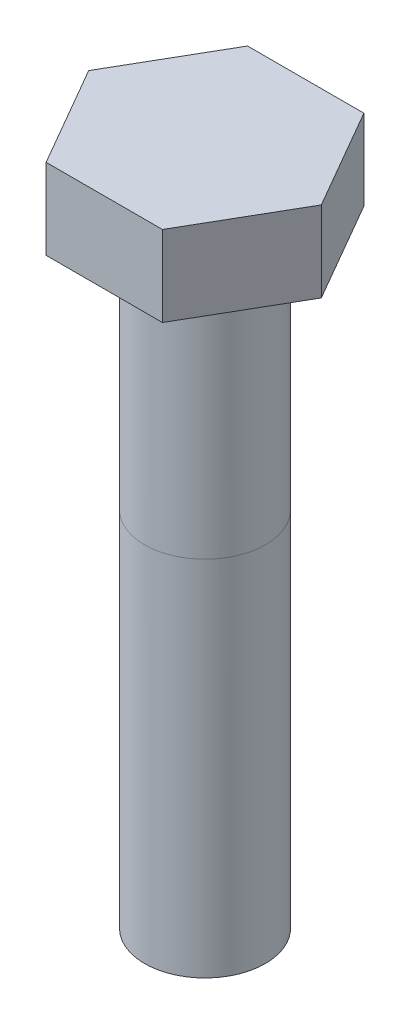
ISO-10303-21;
HEADER;
FILE_DESCRIPTION(('STEP AP214'),'2;1');
FILE_NAME('part.step','',(''),(''),'','','');
FILE_SCHEMA(('AUTOMOTIVE_DESIGN { 1 0 10303 214 1 1 1 1 }'));
ENDSEC;
DATA;
#1=APPLICATION_CONTEXT('core data for automotive mechanical design processes');
#2=APPLICATION_PROTOCOL_DEFINITION('international standard','automotive_design',2000,#1);
#3=PRODUCT_CONTEXT('',#1,'mechanical');
#4=PRODUCT('Part','Part','',(#3));
#5=PRODUCT_RELATED_PRODUCT_CATEGORY('part','',(#4));
#6=PRODUCT_DEFINITION_FORMATION('','',#4);
#7=PRODUCT_DEFINITION_CONTEXT('part definition',#1,'design');
#8=PRODUCT_DEFINITION('design','',#6,#7);
#9=PRODUCT_DEFINITION_SHAPE('','',#8);
#10=(LENGTH_UNIT() NAMED_UNIT(*) SI_UNIT(.MILLI.,.METRE.));
#11=(NAMED_UNIT(*) PLANE_ANGLE_UNIT() SI_UNIT($,.RADIAN.));
#12=(NAMED_UNIT(*) SI_UNIT($,.STERADIAN.) SOLID_ANGLE_UNIT());
#13=UNCERTAINTY_MEASURE_WITH_UNIT(LENGTH_MEASURE(1.E-05),#10,'distance_accuracy_value','');
#14=(GEOMETRIC_REPRESENTATION_CONTEXT(3) GLOBAL_UNCERTAINTY_ASSIGNED_CONTEXT((#13)) GLOBAL_UNIT_ASSIGNED_CONTEXT((#10,
#11,#12)) REPRESENTATION_CONTEXT('',''));
#15=CARTESIAN_POINT('',(0.,0.,0.));
#16=DIRECTION('',(0.,0.,1.));
#17=DIRECTION('',(1.,0.,0.));
#18=AXIS2_PLACEMENT_3D('',#15,#16,#17);
#19=CARTESIAN_POINT('',(0.,-30.,0.));
#20=DIRECTION('',(0.,1.,0.));
#21=DIRECTION('',(0.,0.,1.));
#22=AXIS2_PLACEMENT_3D('',#19,#20,#21);
#23=CYLINDRICAL_SURFACE('',#22,3.);
#24=CARTESIAN_POINT('',(0.,0.,0.));
#25=DIRECTION('',(0.,-1.,0.));
#26=DIRECTION('',(0.,0.,-1.));
#27=AXIS2_PLACEMENT_3D('',#24,#25,#26);
#28=CIRCLE('',#27,3.);
#29=CARTESIAN_POINT('',(0.,0.,-3.));
#30=VERTEX_POINT('',#29);
#31=EDGE_CURVE('E115',#30,#30,#28,.T.);
#32=ORIENTED_EDGE('',*,*,#31,.T.);
#33=EDGE_LOOP('',(#32));
#34=FACE_BOUND('',#33,.T.);
#35=CARTESIAN_POINT('',(0.,-12.,0.));
#36=DIRECTION('',(0.,-1.,0.));
#37=DIRECTION('',(0.,0.,-1.));
#38=AXIS2_PLACEMENT_3D('',#35,#36,#37);
#39=CIRCLE('',#38,3.);
#40=CARTESIAN_POINT('',(3.,-12.,0.));
#41=VERTEX_POINT('',#40);
#42=CARTESIAN_POINT('',(-3.,-12.,0.));
#43=VERTEX_POINT('',#42);
#44=EDGE_CURVE('E11',#41,#43,#39,.T.);
#45=ORIENTED_EDGE('',*,*,#44,.F.);
#46=EDGE_CURVE('E40',#43,#41,#39,.T.);
#47=ORIENTED_EDGE('',*,*,#46,.F.);
#48=EDGE_LOOP('',(#45,#47));
#49=FACE_BOUND('',#48,.T.);
#50=ADVANCED_FACE('F36',(#34,#49),#23,.T.);
#51=CARTESIAN_POINT('',(2.88675134594813,4.,5.));
#52=DIRECTION('',(-0.866025403784439,0.,-0.5));
#53=DIRECTION('',(-0.5,0.,0.866025403784439));
#54=AXIS2_PLACEMENT_3D('',#51,#52,#53);
#55=PLANE('',#54);
#56=DIRECTION('',(0.5,0.,-0.866025403784439));
#57=VECTOR('',#56,1.);
#58=CARTESIAN_POINT('',(2.88675134594813,0.,5.));
#59=LINE('',#58,#57);
#60=CARTESIAN_POINT('',(2.88675134594813,0.,5.));
#61=VERTEX_POINT('',#60);
#62=CARTESIAN_POINT('',(5.77350269189626,0.,0.));
#63=VERTEX_POINT('',#62);
#64=EDGE_CURVE('E114',#61,#63,#59,.T.);
#65=ORIENTED_EDGE('',*,*,#64,.T.);
#66=DIRECTION('',(0.,-1.,0.));
#67=VECTOR('',#66,1.);
#68=CARTESIAN_POINT('',(5.77350269189626,4.,0.));
#69=LINE('',#68,#67);
#70=CARTESIAN_POINT('',(5.77350269189626,4.,0.));
#71=VERTEX_POINT('',#70);
#72=EDGE_CURVE('E95',#71,#63,#69,.T.);
#73=ORIENTED_EDGE('',*,*,#72,.F.);
#74=DIRECTION('',(0.5,0.,-0.866025403784439));
#75=VECTOR('',#74,1.);
#76=CARTESIAN_POINT('',(2.88675134594813,4.,5.));
#77=LINE('',#76,#75);
#78=CARTESIAN_POINT('',(2.88675134594813,4.,5.));
#79=VERTEX_POINT('',#78);
#80=EDGE_CURVE('E102',#79,#71,#77,.T.);
#81=ORIENTED_EDGE('',*,*,#80,.F.);
#82=DIRECTION('',(0.,-1.,0.));
#83=VECTOR('',#82,1.);
#84=CARTESIAN_POINT('',(2.88675134594813,4.,5.));
#85=LINE('',#84,#83);
#86=EDGE_CURVE('E129',#79,#61,#85,.T.);
#87=ORIENTED_EDGE('',*,*,#86,.T.);
#88=EDGE_LOOP('',(#65,#73,#81,#87));
#89=FACE_BOUND('',#88,.T.);
#90=ADVANCED_FACE('F38',(#89),#55,.F.);
#91=CARTESIAN_POINT('',(5.77350269189626,4.,0.));
#92=DIRECTION('',(-0.866025403784439,0.,0.5));
#93=DIRECTION('',(0.5,0.,0.866025403784439));
#94=AXIS2_PLACEMENT_3D('',#91,#92,#93);
#95=PLANE('',#94);
#96=DIRECTION('',(-0.5,0.,-0.866025403784438));
#97=VECTOR('',#96,1.);
#98=CARTESIAN_POINT('',(5.77350269189626,0.,0.));
#99=LINE('',#98,#97);
#100=CARTESIAN_POINT('',(2.88675134594813,0.,-5.));
#101=VERTEX_POINT('',#100);
#102=EDGE_CURVE('E138',#63,#101,#99,.T.);
#103=ORIENTED_EDGE('',*,*,#102,.T.);
#104=DIRECTION('',(0.,-1.,0.));
#105=VECTOR('',#104,1.);
#106=CARTESIAN_POINT('',(2.88675134594813,4.,-5.));
#107=LINE('',#106,#105);
#108=CARTESIAN_POINT('',(2.88675134594813,4.,-5.));
#109=VERTEX_POINT('',#108);
#110=EDGE_CURVE('E98',#109,#101,#107,.T.);
#111=ORIENTED_EDGE('',*,*,#110,.F.);
#112=DIRECTION('',(-0.5,0.,-0.866025403784438));
#113=VECTOR('',#112,1.);
#114=CARTESIAN_POINT('',(5.77350269189626,4.,0.));
#115=LINE('',#114,#113);
#116=EDGE_CURVE('E91',#71,#109,#115,.T.);
#117=ORIENTED_EDGE('',*,*,#116,.F.);
#118=ORIENTED_EDGE('',*,*,#72,.T.);
#119=EDGE_LOOP('',(#103,#111,#117,#118));
#120=FACE_BOUND('',#119,.T.);
#121=ADVANCED_FACE('F93',(#120),#95,.F.);
#122=CARTESIAN_POINT('',(2.88675134594813,4.,-5.));
#123=DIRECTION('',(0.,0.,1.));
#124=DIRECTION('',(1.,0.,0.));
#125=AXIS2_PLACEMENT_3D('',#122,#123,#124);
#126=PLANE('',#125);
#127=DIRECTION('',(-1.,0.,0.));
#128=VECTOR('',#127,1.);
#129=CARTESIAN_POINT('',(2.88675134594813,0.,-5.));
#130=LINE('',#129,#128);
#131=CARTESIAN_POINT('',(-2.88675134594813,0.,-5.));
#132=VERTEX_POINT('',#131);
#133=EDGE_CURVE('E136',#101,#132,#130,.T.);
#134=ORIENTED_EDGE('',*,*,#133,.T.);
#135=DIRECTION('',(0.,-1.,0.));
#136=VECTOR('',#135,1.);
#137=CARTESIAN_POINT('',(-2.88675134594813,4.,-5.));
#138=LINE('',#137,#136);
#139=CARTESIAN_POINT('',(-2.88675134594813,4.,-5.));
#140=VERTEX_POINT('',#139);
#141=EDGE_CURVE('E118',#140,#132,#138,.T.);
#142=ORIENTED_EDGE('',*,*,#141,.F.);
#143=DIRECTION('',(-1.,0.,0.));
#144=VECTOR('',#143,1.);
#145=CARTESIAN_POINT('',(2.88675134594813,4.,-5.));
#146=LINE('',#145,#144);
#147=EDGE_CURVE('E101',#109,#140,#146,.T.);
#148=ORIENTED_EDGE('',*,*,#147,.F.);
#149=ORIENTED_EDGE('',*,*,#110,.T.);
#150=EDGE_LOOP('',(#134,#142,#148,#149));
#151=FACE_BOUND('',#150,.T.);
#152=ADVANCED_FACE('F177',(#151),#126,.F.);
#153=CARTESIAN_POINT('',(-2.88675134594813,4.,-5.));
#154=DIRECTION('',(0.866025403784439,0.,0.5));
#155=DIRECTION('',(0.5,0.,-0.866025403784439));
#156=AXIS2_PLACEMENT_3D('',#153,#154,#155);
#157=PLANE('',#156);
#158=DIRECTION('',(-0.5,0.,0.866025403784439));
#159=VECTOR('',#158,1.);
#160=CARTESIAN_POINT('',(-2.88675134594813,0.,-5.));
#161=LINE('',#160,#159);
#162=CARTESIAN_POINT('',(-5.77350269189626,0.,0.));
#163=VERTEX_POINT('',#162);
#164=EDGE_CURVE('E134',#132,#163,#161,.T.);
#165=ORIENTED_EDGE('',*,*,#164,.T.);
#166=DIRECTION('',(0.,-1.,0.));
#167=VECTOR('',#166,1.);
#168=CARTESIAN_POINT('',(-5.77350269189626,4.,0.));
#169=LINE('',#168,#167);
#170=CARTESIAN_POINT('',(-5.77350269189626,4.,0.));
#171=VERTEX_POINT('',#170);
#172=EDGE_CURVE('E123',#171,#163,#169,.T.);
#173=ORIENTED_EDGE('',*,*,#172,.F.);
#174=DIRECTION('',(-0.5,0.,0.866025403784439));
#175=VECTOR('',#174,1.);
#176=CARTESIAN_POINT('',(-2.88675134594813,4.,-5.));
#177=LINE('',#176,#175);
#178=EDGE_CURVE('E145',#140,#171,#177,.T.);
#179=ORIENTED_EDGE('',*,*,#178,.F.);
#180=ORIENTED_EDGE('',*,*,#141,.T.);
#181=EDGE_LOOP('',(#165,#173,#179,#180));
#182=FACE_BOUND('',#181,.T.);
#183=ADVANCED_FACE('F184',(#182),#157,.F.);
#184=CARTESIAN_POINT('',(-5.77350269189626,4.,0.));
#185=DIRECTION('',(0.866025403784438,0.,-0.5));
#186=DIRECTION('',(-0.5,0.,-0.866025403784438));
#187=AXIS2_PLACEMENT_3D('',#184,#185,#186);
#188=PLANE('',#187);
#189=DIRECTION('',(0.5,0.,0.866025403784438));
#190=VECTOR('',#189,1.);
#191=CARTESIAN_POINT('',(-5.77350269189626,0.,0.));
#192=LINE('',#191,#190);
#193=CARTESIAN_POINT('',(-2.88675134594813,0.,5.));
#194=VERTEX_POINT('',#193);
#195=EDGE_CURVE('E132',#163,#194,#192,.T.);
#196=ORIENTED_EDGE('',*,*,#195,.T.);
#197=DIRECTION('',(0.,-1.,0.));
#198=VECTOR('',#197,1.);
#199=CARTESIAN_POINT('',(-2.88675134594813,4.,5.));
#200=LINE('',#199,#198);
#201=CARTESIAN_POINT('',(-2.88675134594813,4.,5.));
#202=VERTEX_POINT('',#201);
#203=EDGE_CURVE('E126',#202,#194,#200,.T.);
#204=ORIENTED_EDGE('',*,*,#203,.F.);
#205=DIRECTION('',(0.5,0.,0.866025403784438));
#206=VECTOR('',#205,1.);
#207=CARTESIAN_POINT('',(-5.77350269189626,4.,0.));
#208=LINE('',#207,#206);
#209=EDGE_CURVE('E143',#171,#202,#208,.T.);
#210=ORIENTED_EDGE('',*,*,#209,.F.);
#211=ORIENTED_EDGE('',*,*,#172,.T.);
#212=EDGE_LOOP('',(#196,#204,#210,#211));
#213=FACE_BOUND('',#212,.T.);
#214=ADVANCED_FACE('F186',(#213),#188,.F.);
#215=CARTESIAN_POINT('',(-2.88675134594813,4.,5.));
#216=DIRECTION('',(0.,0.,-1.));
#217=DIRECTION('',(-1.,0.,0.));
#218=AXIS2_PLACEMENT_3D('',#215,#216,#217);
#219=PLANE('',#218);
#220=DIRECTION('',(1.,0.,0.));
#221=VECTOR('',#220,1.);
#222=CARTESIAN_POINT('',(-2.88675134594813,0.,5.));
#223=LINE('',#222,#221);
#224=EDGE_CURVE('E111',#194,#61,#223,.T.);
#225=ORIENTED_EDGE('',*,*,#224,.T.);
#226=ORIENTED_EDGE('',*,*,#86,.F.);
#227=DIRECTION('',(1.,0.,0.));
#228=VECTOR('',#227,1.);
#229=CARTESIAN_POINT('',(-2.88675134594813,4.,5.));
#230=LINE('',#229,#228);
#231=EDGE_CURVE('E107',#202,#79,#230,.T.);
#232=ORIENTED_EDGE('',*,*,#231,.F.);
#233=ORIENTED_EDGE('',*,*,#203,.T.);
#234=EDGE_LOOP('',(#225,#226,#232,#233));
#235=FACE_BOUND('',#234,.T.);
#236=ADVANCED_FACE('F188',(#235),#219,.F.);
#237=CARTESIAN_POINT('',(0.,4.,0.));
#238=DIRECTION('',(0.,1.,0.));
#239=DIRECTION('',(0.,0.,1.));
#240=AXIS2_PLACEMENT_3D('',#237,#238,#239);
#241=PLANE('',#240);
#242=ORIENTED_EDGE('',*,*,#80,.T.);
#243=ORIENTED_EDGE('',*,*,#116,.T.);
#244=ORIENTED_EDGE('',*,*,#147,.T.);
#245=ORIENTED_EDGE('',*,*,#178,.T.);
#246=ORIENTED_EDGE('',*,*,#209,.T.);
#247=ORIENTED_EDGE('',*,*,#231,.T.);
#248=EDGE_LOOP('',(#242,#243,#244,#245,#246,#247));
#249=FACE_BOUND('',#248,.T.);
#250=ADVANCED_FACE('F105',(#249),#241,.T.);
#251=CARTESIAN_POINT('',(0.,0.,0.));
#252=DIRECTION('',(0.,1.,0.));
#253=DIRECTION('',(0.,0.,1.));
#254=AXIS2_PLACEMENT_3D('',#251,#252,#253);
#255=PLANE('',#254);
#256=ORIENTED_EDGE('',*,*,#31,.F.);
#257=EDGE_LOOP('',(#256));
#258=FACE_BOUND('',#257,.T.);
#259=ORIENTED_EDGE('',*,*,#64,.F.);
#260=ORIENTED_EDGE('',*,*,#224,.F.);
#261=ORIENTED_EDGE('',*,*,#195,.F.);
#262=ORIENTED_EDGE('',*,*,#164,.F.);
#263=ORIENTED_EDGE('',*,*,#133,.F.);
#264=ORIENTED_EDGE('',*,*,#102,.F.);
#265=EDGE_LOOP('',(#259,#260,#261,#262,#263,#264));
#266=FACE_BOUND('',#265,.T.);
#267=ADVANCED_FACE('F155',(#258,#266),#255,.F.);
#268=ORIENTED_EDGE('',*,*,#46,.T.);
#269=ORIENTED_EDGE('',*,*,#44,.T.);
#270=EDGE_LOOP('',(#268,#269));
#271=FACE_BOUND('',#270,.T.);
#272=CARTESIAN_POINT('',(0.,-30.,0.));
#273=DIRECTION('',(0.,-1.,0.));
#274=DIRECTION('',(0.,0.,-1.));
#275=AXIS2_PLACEMENT_3D('',#272,#273,#274);
#276=CIRCLE('',#275,3.);
#277=CARTESIAN_POINT('',(0.,-30.,-3.));
#278=VERTEX_POINT('',#277);
#279=EDGE_CURVE('E141',#278,#278,#276,.T.);
#280=ORIENTED_EDGE('',*,*,#279,.F.);
#281=EDGE_LOOP('',(#280));
#282=FACE_BOUND('',#281,.T.);
#283=ADVANCED_FACE('F153',(#271,#282),#23,.T.);
#284=CARTESIAN_POINT('',(0.,-30.,0.));
#285=DIRECTION('',(0.,-1.,0.));
#286=DIRECTION('',(0.,0.,-1.));
#287=AXIS2_PLACEMENT_3D('',#284,#285,#286);
#288=PLANE('',#287);
#289=ORIENTED_EDGE('',*,*,#279,.T.);
#290=EDGE_LOOP('',(#289));
#291=FACE_BOUND('',#290,.T.);
#292=ADVANCED_FACE('F151',(#291),#288,.T.);
#293=CLOSED_SHELL('',(#50,#90,#121,#152,#183,#214,#236,#250,#267,#283,#292));
#294=MANIFOLD_SOLID_BREP('B2',#293);
#295=ADVANCED_BREP_SHAPE_REPRESENTATION('',(#18,#294),#14);
#296=SHAPE_DEFINITION_REPRESENTATION(#9,#295);
ENDSEC;
END-ISO-10303-21;
